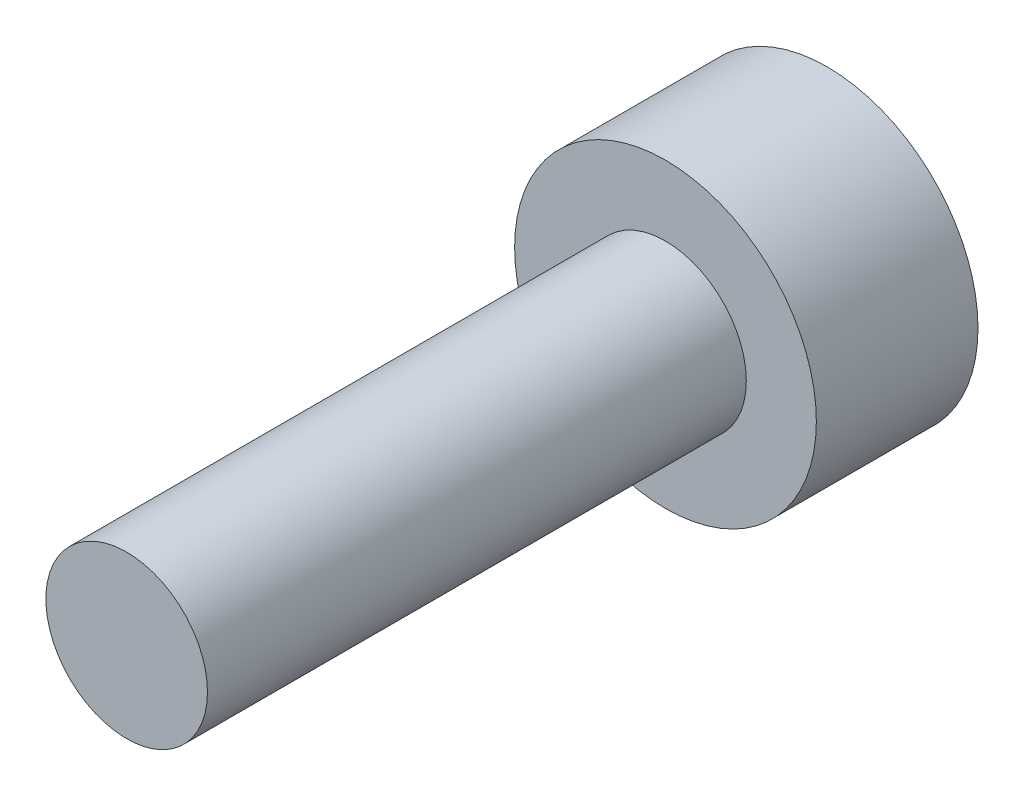
ISO-10303-21;
HEADER;
FILE_DESCRIPTION(('STEP AP214'),'2;1');
FILE_NAME('part.step','',(''),(''),'','','');
FILE_SCHEMA(('AUTOMOTIVE_DESIGN { 1 0 10303 214 1 1 1 1 }'));
ENDSEC;
DATA;
#1=APPLICATION_CONTEXT('core data for automotive mechanical design processes');
#2=APPLICATION_PROTOCOL_DEFINITION('international standard','automotive_design',2000,#1);
#3=PRODUCT_CONTEXT('',#1,'mechanical');
#4=PRODUCT('Part','Part','',(#3));
#5=PRODUCT_RELATED_PRODUCT_CATEGORY('part','',(#4));
#6=PRODUCT_DEFINITION_FORMATION('','',#4);
#7=PRODUCT_DEFINITION_CONTEXT('part definition',#1,'design');
#8=PRODUCT_DEFINITION('design','',#6,#7);
#9=PRODUCT_DEFINITION_SHAPE('','',#8);
#10=(LENGTH_UNIT() NAMED_UNIT(*) SI_UNIT(.MILLI.,.METRE.));
#11=(NAMED_UNIT(*) PLANE_ANGLE_UNIT() SI_UNIT($,.RADIAN.));
#12=(NAMED_UNIT(*) SI_UNIT($,.STERADIAN.) SOLID_ANGLE_UNIT());
#13=UNCERTAINTY_MEASURE_WITH_UNIT(LENGTH_MEASURE(1.E-05),#10,'distance_accuracy_value','');
#14=(GEOMETRIC_REPRESENTATION_CONTEXT(3) GLOBAL_UNCERTAINTY_ASSIGNED_CONTEXT((#13)) GLOBAL_UNIT_ASSIGNED_CONTEXT((#10,
#11,#12)) REPRESENTATION_CONTEXT('',''));
#15=CARTESIAN_POINT('',(0.,0.,0.));
#16=DIRECTION('',(0.,0.,1.));
#17=DIRECTION('',(1.,0.,0.));
#18=AXIS2_PLACEMENT_3D('',#15,#16,#17);
#19=CARTESIAN_POINT('',(0.,0.,-3.));
#20=DIRECTION('',(0.,0.,1.));
#21=DIRECTION('',(1.,0.,0.));
#22=AXIS2_PLACEMENT_3D('',#19,#20,#21);
#23=PLANE('',#22);
#24=CARTESIAN_POINT('',(0.,0.,-3.));
#25=DIRECTION('',(0.,0.,1.));
#26=DIRECTION('',(1.,0.,0.));
#27=AXIS2_PLACEMENT_3D('',#24,#25,#26);
#28=CIRCLE('',#27,2.8);
#29=CARTESIAN_POINT('',(2.8,0.,-3.));
#30=VERTEX_POINT('',#29);
#31=EDGE_CURVE('E112',#30,#30,#28,.T.);
#32=ORIENTED_EDGE('',*,*,#31,.F.);
#33=EDGE_LOOP('',(#32));
#34=FACE_BOUND('',#33,.T.);
#35=DIRECTION('',(0.,-1.,0.));
#36=VECTOR('',#35,1.);
#37=CARTESIAN_POINT('',(1.25,0.,-3.));
#38=LINE('',#37,#36);
#39=CARTESIAN_POINT('',(1.25,0.721687836487032,-3.));
#40=VERTEX_POINT('',#39);
#41=CARTESIAN_POINT('',(1.25,-0.721687836487033,-3.));
#42=VERTEX_POINT('',#41);
#43=EDGE_CURVE('E11',#40,#42,#38,.T.);
#44=ORIENTED_EDGE('',*,*,#43,.F.);
#45=DIRECTION('',(0.866025403784439,-0.5,0.));
#46=VECTOR('',#45,1.);
#47=CARTESIAN_POINT('',(0.625,1.08253175473055,-3.));
#48=LINE('',#47,#46);
#49=CARTESIAN_POINT('',(0.,1.44337567297406,-3.));
#50=VERTEX_POINT('',#49);
#51=EDGE_CURVE('E50',#50,#40,#48,.T.);
#52=ORIENTED_EDGE('',*,*,#51,.F.);
#53=DIRECTION('',(0.866025403784439,0.5,0.));
#54=VECTOR('',#53,1.);
#55=CARTESIAN_POINT('',(-0.625,1.08253175473055,-3.));
#56=LINE('',#55,#54);
#57=CARTESIAN_POINT('',(-1.25,0.721687836487032,-3.));
#58=VERTEX_POINT('',#57);
#59=EDGE_CURVE('E132',#58,#50,#56,.T.);
#60=ORIENTED_EDGE('',*,*,#59,.F.);
#61=DIRECTION('',(0.,1.,0.));
#62=VECTOR('',#61,1.);
#63=CARTESIAN_POINT('',(-1.25,0.,-3.));
#64=LINE('',#63,#62);
#65=CARTESIAN_POINT('',(-1.25,-0.721687836487032,-3.));
#66=VERTEX_POINT('',#65);
#67=EDGE_CURVE('E129',#66,#58,#64,.T.);
#68=ORIENTED_EDGE('',*,*,#67,.F.);
#69=DIRECTION('',(-0.866025403784439,0.5,0.));
#70=VECTOR('',#69,1.);
#71=CARTESIAN_POINT('',(-0.625,-1.08253175473055,-3.));
#72=LINE('',#71,#70);
#73=CARTESIAN_POINT('',(0.,-1.44337567297406,-3.));
#74=VERTEX_POINT('',#73);
#75=EDGE_CURVE('E130',#74,#66,#72,.T.);
#76=ORIENTED_EDGE('',*,*,#75,.F.);
#77=DIRECTION('',(-0.866025403784439,-0.5,0.));
#78=VECTOR('',#77,1.);
#79=CARTESIAN_POINT('',(0.624999999999999,-1.08253175473055,-3.));
#80=LINE('',#79,#78);
#81=EDGE_CURVE('E118',#42,#74,#80,.T.);
#82=ORIENTED_EDGE('',*,*,#81,.F.);
#83=EDGE_LOOP('',(#44,#52,#60,#68,#76,#82));
#84=FACE_BOUND('',#83,.T.);
#85=ADVANCED_FACE('F39',(#34,#84),#23,.F.);
#86=CARTESIAN_POINT('',(0.,0.,0.));
#87=DIRECTION('',(0.,0.,-1.));
#88=DIRECTION('',(-1.,0.,0.));
#89=AXIS2_PLACEMENT_3D('',#86,#87,#88);
#90=CYLINDRICAL_SURFACE('',#89,2.8);
#91=CARTESIAN_POINT('',(0.,0.,0.));
#92=DIRECTION('',(0.,0.,1.));
#93=DIRECTION('',(1.,0.,0.));
#94=AXIS2_PLACEMENT_3D('',#91,#92,#93);
#95=CIRCLE('',#94,2.8);
#96=CARTESIAN_POINT('',(2.8,0.,0.));
#97=VERTEX_POINT('',#96);
#98=EDGE_CURVE('E122',#97,#97,#95,.T.);
#99=ORIENTED_EDGE('',*,*,#98,.F.);
#100=EDGE_LOOP('',(#99));
#101=FACE_BOUND('',#100,.T.);
#102=ORIENTED_EDGE('',*,*,#31,.T.);
#103=EDGE_LOOP('',(#102));
#104=FACE_BOUND('',#103,.T.);
#105=ADVANCED_FACE('F41',(#101,#104),#90,.T.);
#106=CARTESIAN_POINT('',(0.,0.,0.));
#107=DIRECTION('',(0.,0.,1.));
#108=DIRECTION('',(1.,0.,0.));
#109=AXIS2_PLACEMENT_3D('',#106,#107,#108);
#110=PLANE('',#109);
#111=CARTESIAN_POINT('',(0.,0.,0.));
#112=DIRECTION('',(0.,0.,1.));
#113=DIRECTION('',(1.,0.,0.));
#114=AXIS2_PLACEMENT_3D('',#111,#112,#113);
#115=CIRCLE('',#114,1.5);
#116=CARTESIAN_POINT('',(1.5,0.,0.));
#117=VERTEX_POINT('',#116);
#118=EDGE_CURVE('E120',#117,#117,#115,.T.);
#119=ORIENTED_EDGE('',*,*,#118,.F.);
#120=EDGE_LOOP('',(#119));
#121=FACE_BOUND('',#120,.T.);
#122=ORIENTED_EDGE('',*,*,#98,.T.);
#123=EDGE_LOOP('',(#122));
#124=FACE_BOUND('',#123,.T.);
#125=ADVANCED_FACE('F179',(#121,#124),#110,.T.);
#126=CARTESIAN_POINT('',(0.,0.,10.));
#127=DIRECTION('',(0.,0.,-1.));
#128=DIRECTION('',(-1.,0.,0.));
#129=AXIS2_PLACEMENT_3D('',#126,#127,#128);
#130=CYLINDRICAL_SURFACE('',#129,1.5);
#131=CARTESIAN_POINT('',(0.,0.,10.));
#132=DIRECTION('',(0.,0.,1.));
#133=DIRECTION('',(1.,0.,0.));
#134=AXIS2_PLACEMENT_3D('',#131,#132,#133);
#135=CIRCLE('',#134,1.5);
#136=CARTESIAN_POINT('',(1.5,0.,10.));
#137=VERTEX_POINT('',#136);
#138=EDGE_CURVE('E110',#137,#137,#135,.T.);
#139=ORIENTED_EDGE('',*,*,#138,.F.);
#140=EDGE_LOOP('',(#139));
#141=FACE_BOUND('',#140,.T.);
#142=ORIENTED_EDGE('',*,*,#118,.T.);
#143=EDGE_LOOP('',(#142));
#144=FACE_BOUND('',#143,.T.);
#145=ADVANCED_FACE('F184',(#141,#144),#130,.T.);
#146=CARTESIAN_POINT('',(0.,0.,10.));
#147=DIRECTION('',(0.,0.,1.));
#148=DIRECTION('',(1.,0.,0.));
#149=AXIS2_PLACEMENT_3D('',#146,#147,#148);
#150=PLANE('',#149);
#151=ORIENTED_EDGE('',*,*,#138,.T.);
#152=EDGE_LOOP('',(#151));
#153=FACE_BOUND('',#152,.T.);
#154=ADVANCED_FACE('F189',(#153),#150,.T.);
#155=CARTESIAN_POINT('',(1.25,-0.721687836487033,-1.4));
#156=DIRECTION('',(-1.,0.,0.));
#157=DIRECTION('',(0.,-1.,0.));
#158=AXIS2_PLACEMENT_3D('',#155,#156,#157);
#159=PLANE('',#158);
#160=ORIENTED_EDGE('',*,*,#43,.T.);
#161=DIRECTION('',(0.,0.,-1.));
#162=VECTOR('',#161,1.);
#163=CARTESIAN_POINT('',(1.25,-0.721687836487033,-1.4));
#164=LINE('',#163,#162);
#165=CARTESIAN_POINT('',(1.25,-0.721687836487033,-1.4));
#166=VERTEX_POINT('',#165);
#167=EDGE_CURVE('E53',#166,#42,#164,.T.);
#168=ORIENTED_EDGE('',*,*,#167,.F.);
#169=DIRECTION('',(0.,1.,0.));
#170=VECTOR('',#169,1.);
#171=CARTESIAN_POINT('',(1.25,-0.721687836487033,-1.4));
#172=LINE('',#171,#170);
#173=CARTESIAN_POINT('',(1.25,0.721687836487032,-1.4));
#174=VERTEX_POINT('',#173);
#175=EDGE_CURVE('E96',#166,#174,#172,.T.);
#176=ORIENTED_EDGE('',*,*,#175,.T.);
#177=DIRECTION('',(0.,0.,-1.));
#178=VECTOR('',#177,1.);
#179=CARTESIAN_POINT('',(1.25,0.721687836487032,-1.4));
#180=LINE('',#179,#178);
#181=EDGE_CURVE('E103',#174,#40,#180,.T.);
#182=ORIENTED_EDGE('',*,*,#181,.T.);
#183=EDGE_LOOP('',(#160,#168,#176,#182));
#184=FACE_BOUND('',#183,.T.);
#185=ADVANCED_FACE('F105',(#184),#159,.T.);
#186=CARTESIAN_POINT('',(1.25,0.721687836487032,-1.4));
#187=DIRECTION('',(-0.5,-0.866025403784439,0.));
#188=DIRECTION('',(0.866025403784439,-0.5,0.));
#189=AXIS2_PLACEMENT_3D('',#186,#187,#188);
#190=PLANE('',#189);
#191=ORIENTED_EDGE('',*,*,#51,.T.);
#192=ORIENTED_EDGE('',*,*,#181,.F.);
#193=DIRECTION('',(-0.866025403784439,0.5,0.));
#194=VECTOR('',#193,1.);
#195=CARTESIAN_POINT('',(1.25,0.721687836487032,-1.4));
#196=LINE('',#195,#194);
#197=CARTESIAN_POINT('',(0.,1.44337567297406,-1.4));
#198=VERTEX_POINT('',#197);
#199=EDGE_CURVE('E95',#174,#198,#196,.T.);
#200=ORIENTED_EDGE('',*,*,#199,.T.);
#201=DIRECTION('',(0.,0.,-1.));
#202=VECTOR('',#201,1.);
#203=CARTESIAN_POINT('',(0.,1.44337567297406,-1.4));
#204=LINE('',#203,#202);
#205=EDGE_CURVE('E107',#198,#50,#204,.T.);
#206=ORIENTED_EDGE('',*,*,#205,.T.);
#207=EDGE_LOOP('',(#191,#192,#200,#206));
#208=FACE_BOUND('',#207,.T.);
#209=ADVANCED_FACE('F106',(#208),#190,.T.);
#210=CARTESIAN_POINT('',(0.,1.44337567297406,-1.4));
#211=DIRECTION('',(0.5,-0.866025403784439,0.));
#212=DIRECTION('',(0.866025403784439,0.5,0.));
#213=AXIS2_PLACEMENT_3D('',#210,#211,#212);
#214=PLANE('',#213);
#215=ORIENTED_EDGE('',*,*,#59,.T.);
#216=ORIENTED_EDGE('',*,*,#205,.F.);
#217=DIRECTION('',(-0.866025403784439,-0.5,0.));
#218=VECTOR('',#217,1.);
#219=CARTESIAN_POINT('',(0.,1.44337567297406,-1.4));
#220=LINE('',#219,#218);
#221=CARTESIAN_POINT('',(-1.25,0.721687836487032,-1.4));
#222=VERTEX_POINT('',#221);
#223=EDGE_CURVE('E98',#198,#222,#220,.T.);
#224=ORIENTED_EDGE('',*,*,#223,.T.);
#225=DIRECTION('',(0.,0.,-1.));
#226=VECTOR('',#225,1.);
#227=CARTESIAN_POINT('',(-1.25,0.721687836487032,-1.4));
#228=LINE('',#227,#226);
#229=EDGE_CURVE('E114',#222,#58,#228,.T.);
#230=ORIENTED_EDGE('',*,*,#229,.T.);
#231=EDGE_LOOP('',(#215,#216,#224,#230));
#232=FACE_BOUND('',#231,.T.);
#233=ADVANCED_FACE('F133',(#232),#214,.T.);
#234=CARTESIAN_POINT('',(-1.25,0.721687836487032,-1.4));
#235=DIRECTION('',(1.,0.,0.));
#236=DIRECTION('',(0.,1.,0.));
#237=AXIS2_PLACEMENT_3D('',#234,#235,#236);
#238=PLANE('',#237);
#239=ORIENTED_EDGE('',*,*,#67,.T.);
#240=ORIENTED_EDGE('',*,*,#229,.F.);
#241=DIRECTION('',(0.,-1.,0.));
#242=VECTOR('',#241,1.);
#243=CARTESIAN_POINT('',(-1.25,0.721687836487032,-1.4));
#244=LINE('',#243,#242);
#245=CARTESIAN_POINT('',(-1.25,-0.721687836487032,-1.4));
#246=VERTEX_POINT('',#245);
#247=EDGE_CURVE('E157',#222,#246,#244,.T.);
#248=ORIENTED_EDGE('',*,*,#247,.T.);
#249=DIRECTION('',(0.,0.,-1.));
#250=VECTOR('',#249,1.);
#251=CARTESIAN_POINT('',(-1.25,-0.721687836487032,-1.4));
#252=LINE('',#251,#250);
#253=EDGE_CURVE('E151',#246,#66,#252,.T.);
#254=ORIENTED_EDGE('',*,*,#253,.T.);
#255=EDGE_LOOP('',(#239,#240,#248,#254));
#256=FACE_BOUND('',#255,.T.);
#257=ADVANCED_FACE('F165',(#256),#238,.T.);
#258=CARTESIAN_POINT('',(-1.25,-0.721687836487032,-1.4));
#259=DIRECTION('',(0.5,0.866025403784439,0.));
#260=DIRECTION('',(-0.866025403784439,0.5,0.));
#261=AXIS2_PLACEMENT_3D('',#258,#259,#260);
#262=PLANE('',#261);
#263=ORIENTED_EDGE('',*,*,#75,.T.);
#264=ORIENTED_EDGE('',*,*,#253,.F.);
#265=DIRECTION('',(0.866025403784439,-0.5,0.));
#266=VECTOR('',#265,1.);
#267=CARTESIAN_POINT('',(-1.25,-0.721687836487032,-1.4));
#268=LINE('',#267,#266);
#269=CARTESIAN_POINT('',(0.,-1.44337567297406,-1.4));
#270=VERTEX_POINT('',#269);
#271=EDGE_CURVE('E147',#246,#270,#268,.T.);
#272=ORIENTED_EDGE('',*,*,#271,.T.);
#273=DIRECTION('',(0.,0.,-1.));
#274=VECTOR('',#273,1.);
#275=CARTESIAN_POINT('',(0.,-1.44337567297406,-1.4));
#276=LINE('',#275,#274);
#277=EDGE_CURVE('E145',#270,#74,#276,.T.);
#278=ORIENTED_EDGE('',*,*,#277,.T.);
#279=EDGE_LOOP('',(#263,#264,#272,#278));
#280=FACE_BOUND('',#279,.T.);
#281=ADVANCED_FACE('F148',(#280),#262,.T.);
#282=CARTESIAN_POINT('',(0.,-1.44337567297406,-1.4));
#283=DIRECTION('',(-0.5,0.866025403784439,0.));
#284=DIRECTION('',(-0.866025403784439,-0.5,0.));
#285=AXIS2_PLACEMENT_3D('',#282,#283,#284);
#286=PLANE('',#285);
#287=ORIENTED_EDGE('',*,*,#81,.T.);
#288=ORIENTED_EDGE('',*,*,#277,.F.);
#289=DIRECTION('',(0.866025403784439,0.5,0.));
#290=VECTOR('',#289,1.);
#291=CARTESIAN_POINT('',(0.,-1.44337567297406,-1.4));
#292=LINE('',#291,#290);
#293=EDGE_CURVE('E152',#270,#166,#292,.T.);
#294=ORIENTED_EDGE('',*,*,#293,.T.);
#295=ORIENTED_EDGE('',*,*,#167,.T.);
#296=EDGE_LOOP('',(#287,#288,#294,#295));
#297=FACE_BOUND('',#296,.T.);
#298=ADVANCED_FACE('F141',(#297),#286,.T.);
#299=CARTESIAN_POINT('',(0.,0.,-1.4));
#300=DIRECTION('',(0.,0.,1.));
#301=DIRECTION('',(1.,0.,0.));
#302=AXIS2_PLACEMENT_3D('',#299,#300,#301);
#303=PLANE('',#302);
#304=ORIENTED_EDGE('',*,*,#175,.F.);
#305=ORIENTED_EDGE('',*,*,#293,.F.);
#306=ORIENTED_EDGE('',*,*,#271,.F.);
#307=ORIENTED_EDGE('',*,*,#247,.F.);
#308=ORIENTED_EDGE('',*,*,#223,.F.);
#309=ORIENTED_EDGE('',*,*,#199,.F.);
#310=EDGE_LOOP('',(#304,#305,#306,#307,#308,#309));
#311=FACE_BOUND('',#310,.T.);
#312=ADVANCED_FACE('F94',(#311),#303,.F.);
#313=CLOSED_SHELL('',(#85,#105,#125,#145,#154,#185,#209,#233,#257,#281,#298,#312));
#314=MANIFOLD_SOLID_BREP('B2',#313);
#315=ADVANCED_BREP_SHAPE_REPRESENTATION('',(#18,#314),#14);
#316=SHAPE_DEFINITION_REPRESENTATION(#9,#315);
ENDSEC;
END-ISO-10303-21;
